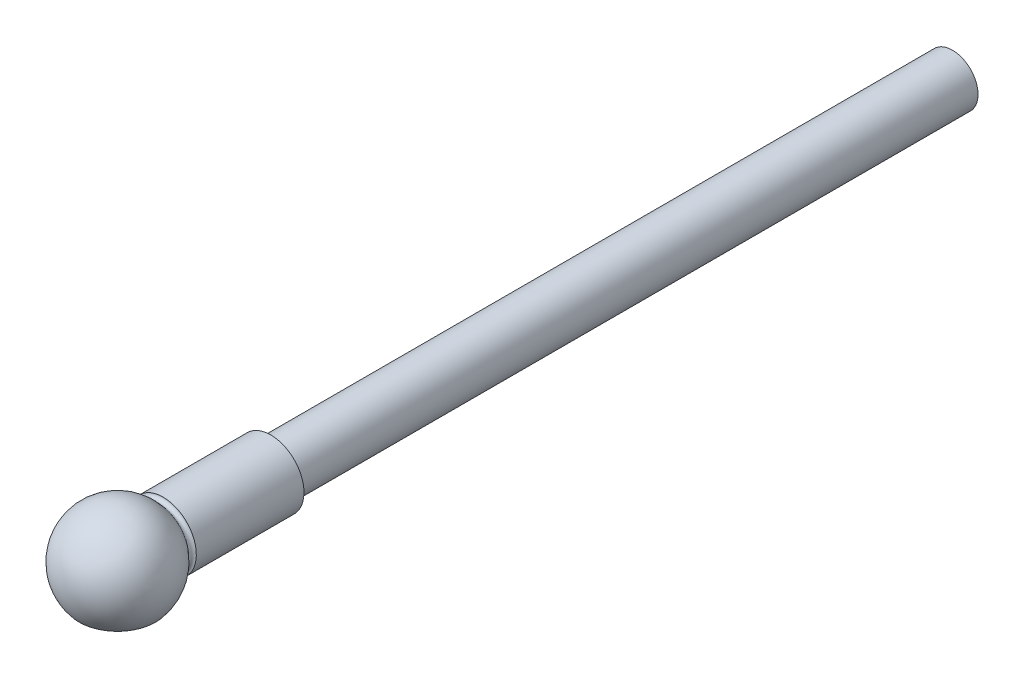
ISO-10303-21;
HEADER;
FILE_DESCRIPTION(('STEP AP214'),'2;1');
FILE_NAME('part.step','',(''),(''),'','','');
FILE_SCHEMA(('AUTOMOTIVE_DESIGN { 1 0 10303 214 1 1 1 1 }'));
ENDSEC;
DATA;
#1=APPLICATION_CONTEXT('core data for automotive mechanical design processes');
#2=APPLICATION_PROTOCOL_DEFINITION('international standard','automotive_design',2000,#1);
#3=PRODUCT_CONTEXT('',#1,'mechanical');
#4=PRODUCT('Part','Part','',(#3));
#5=PRODUCT_RELATED_PRODUCT_CATEGORY('part','',(#4));
#6=PRODUCT_DEFINITION_FORMATION('','',#4);
#7=PRODUCT_DEFINITION_CONTEXT('part definition',#1,'design');
#8=PRODUCT_DEFINITION('design','',#6,#7);
#9=PRODUCT_DEFINITION_SHAPE('','',#8);
#10=(LENGTH_UNIT() NAMED_UNIT(*) SI_UNIT(.MILLI.,.METRE.));
#11=(NAMED_UNIT(*) PLANE_ANGLE_UNIT() SI_UNIT($,.RADIAN.));
#12=(NAMED_UNIT(*) SI_UNIT($,.STERADIAN.) SOLID_ANGLE_UNIT());
#13=UNCERTAINTY_MEASURE_WITH_UNIT(LENGTH_MEASURE(1.E-05),#10,'distance_accuracy_value','');
#14=(GEOMETRIC_REPRESENTATION_CONTEXT(3) GLOBAL_UNCERTAINTY_ASSIGNED_CONTEXT((#13)) GLOBAL_UNIT_ASSIGNED_CONTEXT((#10,
#11,#12)) REPRESENTATION_CONTEXT('',''));
#15=CARTESIAN_POINT('',(0.,0.,0.));
#16=DIRECTION('',(0.,0.,1.));
#17=DIRECTION('',(1.,0.,0.));
#18=AXIS2_PLACEMENT_3D('',#15,#16,#17);
#19=CARTESIAN_POINT('',(0.,5.,14.17));
#20=DIRECTION('',(0.,0.,-1.));
#21=DIRECTION('',(-1.,0.,0.));
#22=AXIS2_PLACEMENT_3D('',#19,#20,#21);
#23=PLANE('',#22);
#24=CARTESIAN_POINT('',(0.,0.,14.17));
#25=DIRECTION('',(0.,0.,-1.));
#26=DIRECTION('',(-1.,0.,0.));
#27=AXIS2_PLACEMENT_3D('',#24,#25,#26);
#28=CIRCLE('',#27,5.);
#29=CARTESIAN_POINT('',(-5.,0.,14.17));
#30=VERTEX_POINT('',#29);
#31=EDGE_CURVE('E12',#30,#30,#28,.T.);
#32=ORIENTED_EDGE('',*,*,#31,.T.);
#33=EDGE_LOOP('',(#32));
#34=FACE_BOUND('',#33,.T.);
#35=ADVANCED_FACE('F48',(#34),#23,.T.);
#36=CARTESIAN_POINT('',(0.,0.,147.546));
#37=DIRECTION('',(0.,0.,-1.));
#38=DIRECTION('',(-1.,0.,0.));
#39=AXIS2_PLACEMENT_3D('',#36,#37,#38);
#40=CYLINDRICAL_SURFACE('',#39,5.);
#41=CARTESIAN_POINT('',(0.,0.,147.546));
#42=DIRECTION('',(0.,0.,-1.));
#43=DIRECTION('',(0.,1.,0.));
#44=AXIS2_PLACEMENT_3D('',#41,#42,#43);
#45=CIRCLE('',#44,5.);
#46=CARTESIAN_POINT('',(0.,5.,147.546));
#47=VERTEX_POINT('',#46);
#48=EDGE_CURVE('E54',#47,#47,#45,.F.);
#49=ORIENTED_EDGE('',*,*,#48,.F.);
#50=EDGE_LOOP('',(#49));
#51=FACE_BOUND('',#50,.T.);
#52=ORIENTED_EDGE('',*,*,#31,.F.);
#53=EDGE_LOOP('',(#52));
#54=FACE_BOUND('',#53,.T.);
#55=ADVANCED_FACE('F112',(#51,#54),#40,.T.);
#56=CARTESIAN_POINT('',(0.,0.,177.546));
#57=DIRECTION('',(0.,0.,1.));
#58=DIRECTION('',(0.,1.,0.));
#59=AXIS2_PLACEMENT_3D('',#56,#57,#58);
#60=SPHERICAL_SURFACE('',#59,6.59999999999999);
#61=CARTESIAN_POINT('',(0.,0.,177.546));
#62=DIRECTION('',(0.,-1.,0.));
#63=DIRECTION('',(0.,0.,1.));
#64=AXIS2_PLACEMENT_3D('',#61,#62,#63);
#65=SPHERICAL_SURFACE('',#64,6.59999999999999);
#66=CARTESIAN_POINT('',(0.,0.,177.546));
#67=DIRECTION('',(0.,-1.,0.));
#68=DIRECTION('',(0.,0.,1.));
#69=AXIS2_PLACEMENT_3D('',#66,#67,#68);
#70=CIRCLE('',#69,6.59999999999999);
#71=CARTESIAN_POINT('',(0.,0.,184.146));
#72=VERTEX_POINT('',#71);
#73=EDGE_CURVE('E76',#72,#72,#70,.T.);
#74=ORIENTED_EDGE('',*,*,#73,.T.);
#75=EDGE_LOOP('',(#74));
#76=FACE_BOUND('',#75,.T.);
#77=ADVANCED_FACE('F80',(#76),#65,.F.);
#78=CARTESIAN_POINT('',(0.,-6.50000000000002,184.146));
#79=DIRECTION('',(0.,1.,0.));
#80=DIRECTION('',(0.,0.,-1.));
#81=AXIS2_PLACEMENT_3D('',#78,#79,#80);
#82=PLANE('',#81);
#83=CARTESIAN_POINT('',(0.,-6.50000000000002,177.546));
#84=DIRECTION('',(0.,-1.,0.));
#85=DIRECTION('',(0.,0.,1.));
#86=AXIS2_PLACEMENT_3D('',#83,#84,#85);
#87=CIRCLE('',#86,6.59999999999999);
#88=CARTESIAN_POINT('',(0.,-6.50000000000002,184.146));
#89=VERTEX_POINT('',#88);
#90=EDGE_CURVE('E73',#89,#89,#87,.T.);
#91=ORIENTED_EDGE('',*,*,#90,.F.);
#92=EDGE_LOOP('',(#91));
#93=FACE_BOUND('',#92,.T.);
#94=CARTESIAN_POINT('',(0.,-6.50000000000002,177.546));
#95=DIRECTION('',(0.,-1.,0.));
#96=DIRECTION('',(0.,0.,1.));
#97=AXIS2_PLACEMENT_3D('',#94,#95,#96);
#98=CIRCLE('',#97,7.47521477952304);
#99=CARTESIAN_POINT('',(0.,-6.50000000000002,185.021214779523));
#100=VERTEX_POINT('',#99);
#101=EDGE_CURVE('E70',#100,#100,#98,.T.);
#102=ORIENTED_EDGE('',*,*,#101,.T.);
#103=EDGE_LOOP('',(#102));
#104=FACE_BOUND('',#103,.T.);
#105=ADVANCED_FACE('F86',(#93,#104),#82,.F.);
#106=CARTESIAN_POINT('',(0.,0.,177.546));
#107=DIRECTION('',(0.,-1.,0.));
#108=DIRECTION('',(0.,0.,1.));
#109=AXIS2_PLACEMENT_3D('',#106,#107,#108);
#110=CYLINDRICAL_SURFACE('',#109,6.59999999999999);
#111=ORIENTED_EDGE('',*,*,#73,.F.);
#112=EDGE_LOOP('',(#111));
#113=FACE_BOUND('',#112,.T.);
#114=ORIENTED_EDGE('',*,*,#90,.T.);
#115=EDGE_LOOP('',(#114));
#116=FACE_BOUND('',#115,.T.);
#117=ADVANCED_FACE('F82',(#113,#116),#110,.F.);
#118=CARTESIAN_POINT('',(0.,0.,147.546));
#119=DIRECTION('',(0.,0.,-1.));
#120=DIRECTION('',(0.,-1.,0.));
#121=AXIS2_PLACEMENT_3D('',#118,#119,#120);
#122=PLANE('',#121);
#123=ORIENTED_EDGE('',*,*,#48,.T.);
#124=EDGE_LOOP('',(#123));
#125=FACE_BOUND('',#124,.T.);
#126=CARTESIAN_POINT('',(0.,0.,147.546));
#127=DIRECTION('',(0.,0.,1.));
#128=DIRECTION('',(0.,1.,0.));
#129=AXIS2_PLACEMENT_3D('',#126,#127,#128);
#130=CIRCLE('',#129,6.5);
#131=CARTESIAN_POINT('',(0.,6.49999999999997,147.546));
#132=VERTEX_POINT('',#131);
#133=EDGE_CURVE('E58',#132,#132,#130,.T.);
#134=ORIENTED_EDGE('',*,*,#133,.F.);
#135=EDGE_LOOP('',(#134));
#136=FACE_BOUND('',#135,.T.);
#137=ADVANCED_FACE('F85',(#125,#136),#122,.T.);
#138=CARTESIAN_POINT('',(0.,0.,147.546));
#139=DIRECTION('',(0.,0.,1.));
#140=DIRECTION('',(0.,1.,0.));
#141=AXIS2_PLACEMENT_3D('',#138,#139,#140);
#142=CYLINDRICAL_SURFACE('',#141,6.5);
#143=ORIENTED_EDGE('',*,*,#133,.T.);
#144=EDGE_LOOP('',(#143));
#145=FACE_BOUND('',#144,.T.);
#146=CARTESIAN_POINT('',(0.,0.,168.612645886081));
#147=DIRECTION('',(0.,0.,1.));
#148=DIRECTION('',(0.,1.,0.));
#149=AXIS2_PLACEMENT_3D('',#146,#147,#148);
#150=CIRCLE('',#149,6.5);
#151=CARTESIAN_POINT('',(0.,6.49999999999998,168.612645886081));
#152=VERTEX_POINT('',#151);
#153=EDGE_CURVE('E62',#152,#152,#150,.T.);
#154=ORIENTED_EDGE('',*,*,#153,.F.);
#155=EDGE_LOOP('',(#154));
#156=FACE_BOUND('',#155,.T.);
#157=ADVANCED_FACE('F103',(#145,#156),#142,.T.);
#158=CARTESIAN_POINT('',(0.,0.,169.247645886081));
#159=DIRECTION('',(0.,0.,1.));
#160=DIRECTION('',(0.,1.,0.));
#161=AXIS2_PLACEMENT_3D('',#158,#159,#160);
#162=TOROIDAL_SURFACE('',#161,6.5,0.635);
#163=ORIENTED_EDGE('',*,*,#153,.T.);
#164=EDGE_LOOP('',(#163));
#165=FACE_BOUND('',#164,.T.);
#166=CARTESIAN_POINT('',(0.,0.,169.747546736317));
#167=DIRECTION('',(0.,0.,1.));
#168=DIRECTION('',(0.,1.,0.));
#169=AXIS2_PLACEMENT_3D('',#166,#167,#168);
#170=CIRCLE('',#169,6.10843373493976);
#171=CARTESIAN_POINT('',(0.,6.10843373493974,169.747546736317));
#172=VERTEX_POINT('',#171);
#173=EDGE_CURVE('E67',#172,#172,#170,.T.);
#174=ORIENTED_EDGE('',*,*,#173,.F.);
#175=EDGE_LOOP('',(#174));
#176=FACE_BOUND('',#175,.T.);
#177=ADVANCED_FACE('F98',(#165,#176),#162,.F.);
#178=CARTESIAN_POINT('',(0.,0.,177.546));
#179=DIRECTION('',(0.,0.,1.));
#180=DIRECTION('',(0.,1.,0.));
#181=AXIS2_PLACEMENT_3D('',#178,#179,#180);
#182=SPHERICAL_SURFACE('',#181,9.906);
#183=ORIENTED_EDGE('',*,*,#101,.F.);
#184=EDGE_LOOP('',(#183));
#185=FACE_BOUND('',#184,.T.);
#186=ORIENTED_EDGE('',*,*,#173,.T.);
#187=EDGE_LOOP('',(#186));
#188=FACE_BOUND('',#187,.T.);
#189=ADVANCED_FACE('F95',(#185,#188),#182,.T.);
#190=CLOSED_SHELL('',(#35,#55,#77,#105,#117,#137,#157,#177,#189));
#191=MANIFOLD_SOLID_BREP('B2',#190);
#192=ADVANCED_BREP_SHAPE_REPRESENTATION('',(#18,#191),#14);
#193=SHAPE_DEFINITION_REPRESENTATION(#9,#192);
ENDSEC;
END-ISO-10303-21;
